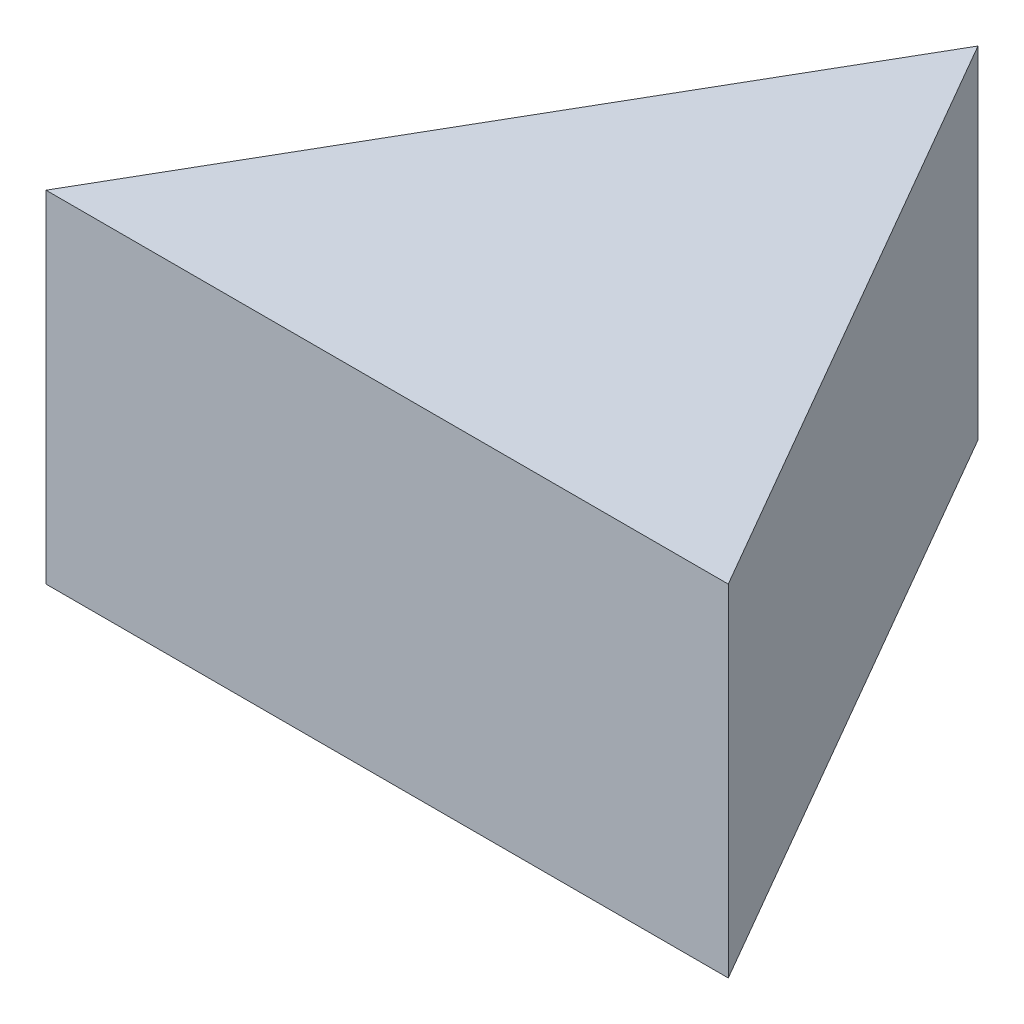
ISO-10303-21;
HEADER;
FILE_DESCRIPTION(('STEP AP214'),'2;1');
FILE_NAME('part.step','',(''),(''),'','','');
FILE_SCHEMA(('AUTOMOTIVE_DESIGN { 1 0 10303 214 1 1 1 1 }'));
ENDSEC;
DATA;
#1=APPLICATION_CONTEXT('core data for automotive mechanical design processes');
#2=APPLICATION_PROTOCOL_DEFINITION('international standard','automotive_design',2000,#1);
#3=PRODUCT_CONTEXT('',#1,'mechanical');
#4=PRODUCT('Part','Part','',(#3));
#5=PRODUCT_RELATED_PRODUCT_CATEGORY('part','',(#4));
#6=PRODUCT_DEFINITION_FORMATION('','',#4);
#7=PRODUCT_DEFINITION_CONTEXT('part definition',#1,'design');
#8=PRODUCT_DEFINITION('design','',#6,#7);
#9=PRODUCT_DEFINITION_SHAPE('','',#8);
#10=(LENGTH_UNIT() NAMED_UNIT(*) SI_UNIT(.MILLI.,.METRE.));
#11=(NAMED_UNIT(*) PLANE_ANGLE_UNIT() SI_UNIT($,.RADIAN.));
#12=(NAMED_UNIT(*) SI_UNIT($,.STERADIAN.) SOLID_ANGLE_UNIT());
#13=UNCERTAINTY_MEASURE_WITH_UNIT(LENGTH_MEASURE(1.E-05),#10,'distance_accuracy_value','');
#14=(GEOMETRIC_REPRESENTATION_CONTEXT(3) GLOBAL_UNCERTAINTY_ASSIGNED_CONTEXT((#13)) GLOBAL_UNIT_ASSIGNED_CONTEXT((#10,
#11,#12)) REPRESENTATION_CONTEXT('',''));
#15=CARTESIAN_POINT('',(0.,0.,0.));
#16=DIRECTION('',(0.,0.,1.));
#17=DIRECTION('',(1.,0.,0.));
#18=AXIS2_PLACEMENT_3D('',#15,#16,#17);
#19=CARTESIAN_POINT('',(0.,20.,0.));
#20=DIRECTION('',(0.,0.,-1.));
#21=DIRECTION('',(-1.,0.,0.));
#22=AXIS2_PLACEMENT_3D('',#19,#20,#21);
#23=PLANE('',#22);
#24=DIRECTION('',(1.,0.,0.));
#25=VECTOR('',#24,1.);
#26=CARTESIAN_POINT('',(0.,0.,0.));
#27=LINE('',#26,#25);
#28=CARTESIAN_POINT('',(-20.,0.,0.));
#29=VERTEX_POINT('',#28);
#30=CARTESIAN_POINT('',(20.,0.,0.));
#31=VERTEX_POINT('',#30);
#32=EDGE_CURVE('E90',#29,#31,#27,.T.);
#33=ORIENTED_EDGE('',*,*,#32,.T.);
#34=DIRECTION('',(0.,-1.,0.));
#35=VECTOR('',#34,1.);
#36=CARTESIAN_POINT('',(20.,20.,0.));
#37=LINE('',#36,#35);
#38=CARTESIAN_POINT('',(20.,20.,0.));
#39=VERTEX_POINT('',#38);
#40=EDGE_CURVE('E11',#39,#31,#37,.T.);
#41=ORIENTED_EDGE('',*,*,#40,.F.);
#42=DIRECTION('',(1.,0.,0.));
#43=VECTOR('',#42,1.);
#44=CARTESIAN_POINT('',(0.,20.,0.));
#45=LINE('',#44,#43);
#46=CARTESIAN_POINT('',(-20.,20.,0.));
#47=VERTEX_POINT('',#46);
#48=EDGE_CURVE('E84',#47,#39,#45,.T.);
#49=ORIENTED_EDGE('',*,*,#48,.F.);
#50=DIRECTION('',(0.,-1.,0.));
#51=VECTOR('',#50,1.);
#52=CARTESIAN_POINT('',(-20.,20.,0.));
#53=LINE('',#52,#51);
#54=EDGE_CURVE('E58',#47,#29,#53,.T.);
#55=ORIENTED_EDGE('',*,*,#54,.T.);
#56=EDGE_LOOP('',(#33,#41,#49,#55));
#57=FACE_BOUND('',#56,.T.);
#58=ADVANCED_FACE('F41',(#57),#23,.F.);
#59=CARTESIAN_POINT('',(14.9999999999999,20.,-8.66025403784444));
#60=DIRECTION('',(-0.866025403784436,0.,0.500000000000004));
#61=DIRECTION('',(0.500000000000004,0.,0.866025403784436));
#62=AXIS2_PLACEMENT_3D('',#59,#60,#61);
#63=PLANE('',#62);
#64=DIRECTION('',(-0.500000000000004,0.,-0.866025403784436));
#65=VECTOR('',#64,1.);
#66=CARTESIAN_POINT('',(14.9999999999999,0.,-8.66025403784444));
#67=LINE('',#66,#65);
#68=CARTESIAN_POINT('',(0.,0.,-34.6410161513772));
#69=VERTEX_POINT('',#68);
#70=EDGE_CURVE('E94',#31,#69,#67,.T.);
#71=ORIENTED_EDGE('',*,*,#70,.T.);
#72=DIRECTION('',(0.,-1.,0.));
#73=VECTOR('',#72,1.);
#74=CARTESIAN_POINT('',(0.,20.,-34.6410161513772));
#75=LINE('',#74,#73);
#76=CARTESIAN_POINT('',(0.,20.,-34.6410161513772));
#77=VERTEX_POINT('',#76);
#78=EDGE_CURVE('E50',#77,#69,#75,.T.);
#79=ORIENTED_EDGE('',*,*,#78,.F.);
#80=DIRECTION('',(-0.500000000000004,0.,-0.866025403784436));
#81=VECTOR('',#80,1.);
#82=CARTESIAN_POINT('',(14.9999999999999,20.,-8.66025403784444));
#83=LINE('',#82,#81);
#84=EDGE_CURVE('E76',#39,#77,#83,.T.);
#85=ORIENTED_EDGE('',*,*,#84,.F.);
#86=ORIENTED_EDGE('',*,*,#40,.T.);
#87=EDGE_LOOP('',(#71,#79,#85,#86));
#88=FACE_BOUND('',#87,.T.);
#89=ADVANCED_FACE('F78',(#88),#63,.F.);
#90=CARTESIAN_POINT('',(-14.9999999999999,20.,-8.66025403784443));
#91=DIRECTION('',(-0.866025403784436,0.,-0.500000000000004));
#92=DIRECTION('',(-0.500000000000004,0.,0.866025403784436));
#93=AXIS2_PLACEMENT_3D('',#90,#91,#92);
#94=PLANE('',#93);
#95=DIRECTION('',(0.500000000000004,0.,-0.866025403784436));
#96=VECTOR('',#95,1.);
#97=CARTESIAN_POINT('',(-14.9999999999999,0.,-8.66025403784443));
#98=LINE('',#97,#96);
#99=EDGE_CURVE('E88',#29,#69,#98,.T.);
#100=ORIENTED_EDGE('',*,*,#99,.F.);
#101=ORIENTED_EDGE('',*,*,#54,.F.);
#102=DIRECTION('',(0.500000000000004,0.,-0.866025403784436));
#103=VECTOR('',#102,1.);
#104=CARTESIAN_POINT('',(-14.9999999999999,20.,-8.66025403784443));
#105=LINE('',#104,#103);
#106=EDGE_CURVE('E83',#47,#77,#105,.T.);
#107=ORIENTED_EDGE('',*,*,#106,.T.);
#108=ORIENTED_EDGE('',*,*,#78,.T.);
#109=EDGE_LOOP('',(#100,#101,#107,#108));
#110=FACE_BOUND('',#109,.T.);
#111=ADVANCED_FACE('F105',(#110),#94,.T.);
#112=CARTESIAN_POINT('',(0.,20.,0.));
#113=DIRECTION('',(0.,1.,0.));
#114=DIRECTION('',(0.,0.,1.));
#115=AXIS2_PLACEMENT_3D('',#112,#113,#114);
#116=PLANE('',#115);
#117=ORIENTED_EDGE('',*,*,#48,.T.);
#118=ORIENTED_EDGE('',*,*,#84,.T.);
#119=ORIENTED_EDGE('',*,*,#106,.F.);
#120=EDGE_LOOP('',(#117,#118,#119));
#121=FACE_BOUND('',#120,.T.);
#122=ADVANCED_FACE('F86',(#121),#116,.T.);
#123=CARTESIAN_POINT('',(0.,0.,0.));
#124=DIRECTION('',(0.,1.,0.));
#125=DIRECTION('',(0.,0.,1.));
#126=AXIS2_PLACEMENT_3D('',#123,#124,#125);
#127=PLANE('',#126);
#128=ORIENTED_EDGE('',*,*,#32,.F.);
#129=ORIENTED_EDGE('',*,*,#99,.T.);
#130=ORIENTED_EDGE('',*,*,#70,.F.);
#131=EDGE_LOOP('',(#128,#129,#130));
#132=FACE_BOUND('',#131,.T.);
#133=ADVANCED_FACE('F112',(#132),#127,.F.);
#134=CLOSED_SHELL('',(#58,#89,#111,#122,#133));
#135=MANIFOLD_SOLID_BREP('B2',#134);
#136=ADVANCED_BREP_SHAPE_REPRESENTATION('',(#18,#135),#14);
#137=SHAPE_DEFINITION_REPRESENTATION(#9,#136);
ENDSEC;
END-ISO-10303-21;
